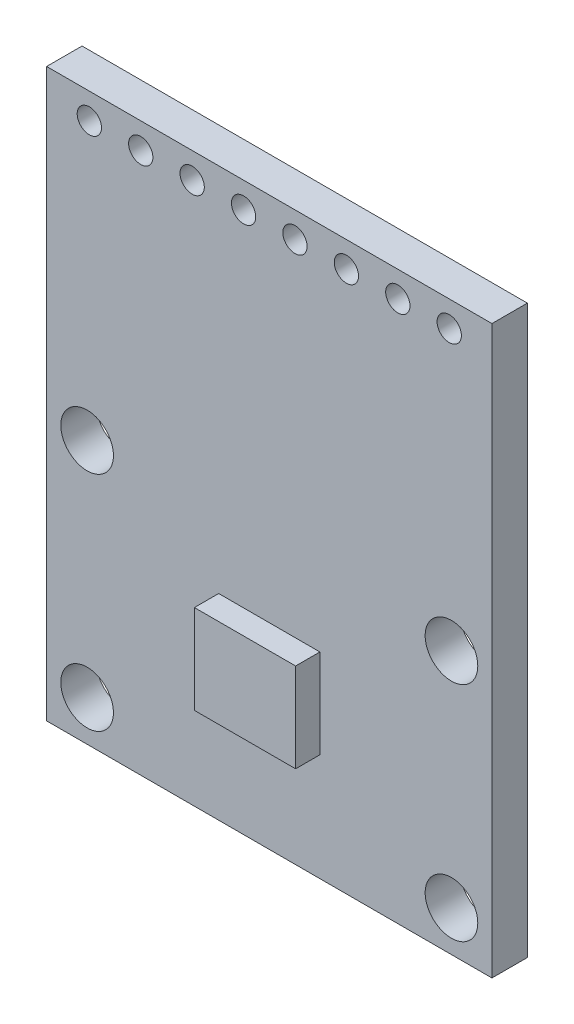
ISO-10303-21;
HEADER;
FILE_DESCRIPTION(('STEP AP214'),'2;1');
FILE_NAME('part.step','',(''),(''),'','','');
FILE_SCHEMA(('AUTOMOTIVE_DESIGN { 1 0 10303 214 1 1 1 1 }'));
ENDSEC;
DATA;
#1=APPLICATION_CONTEXT('core data for automotive mechanical design processes');
#2=APPLICATION_PROTOCOL_DEFINITION('international standard','automotive_design',2000,#1);
#3=PRODUCT_CONTEXT('',#1,'mechanical');
#4=PRODUCT('Part','Part','',(#3));
#5=PRODUCT_RELATED_PRODUCT_CATEGORY('part','',(#4));
#6=PRODUCT_DEFINITION_FORMATION('','',#4);
#7=PRODUCT_DEFINITION_CONTEXT('part definition',#1,'design');
#8=PRODUCT_DEFINITION('design','',#6,#7);
#9=PRODUCT_DEFINITION_SHAPE('','',#8);
#10=(LENGTH_UNIT() NAMED_UNIT(*) SI_UNIT(.MILLI.,.METRE.));
#11=(NAMED_UNIT(*) PLANE_ANGLE_UNIT() SI_UNIT($,.RADIAN.));
#12=(NAMED_UNIT(*) SI_UNIT($,.STERADIAN.) SOLID_ANGLE_UNIT());
#13=UNCERTAINTY_MEASURE_WITH_UNIT(LENGTH_MEASURE(1.E-05),#10,'distance_accuracy_value','');
#14=(GEOMETRIC_REPRESENTATION_CONTEXT(3) GLOBAL_UNCERTAINTY_ASSIGNED_CONTEXT((#13)) GLOBAL_UNIT_ASSIGNED_CONTEXT((#10,
#11,#12)) REPRESENTATION_CONTEXT('',''));
#15=CARTESIAN_POINT('',(0.,0.,0.));
#16=DIRECTION('',(0.,0.,1.));
#17=DIRECTION('',(1.,0.,0.));
#18=AXIS2_PLACEMENT_3D('',#15,#16,#17);
#19=CARTESIAN_POINT('',(0.,0.,1.75));
#20=DIRECTION('',(0.,0.,-1.));
#21=DIRECTION('',(-1.,0.,0.));
#22=AXIS2_PLACEMENT_3D('',#19,#20,#21);
#23=PLANE('',#22);
#24=CARTESIAN_POINT('',(8.89,12.73,1.75));
#25=DIRECTION('',(0.,0.,-1.));
#26=DIRECTION('',(-1.,0.,0.));
#27=AXIS2_PLACEMENT_3D('',#24,#25,#26);
#28=CIRCLE('',#27,0.6);
#29=CARTESIAN_POINT('',(8.29,12.73,1.75));
#30=VERTEX_POINT('',#29);
#31=EDGE_CURVE('E121',#30,#30,#28,.T.);
#32=ORIENTED_EDGE('',*,*,#31,.T.);
#33=EDGE_LOOP('',(#32));
#34=FACE_BOUND('',#33,.T.);
#35=CARTESIAN_POINT('',(3.81,12.73,1.75));
#36=DIRECTION('',(0.,0.,-1.));
#37=DIRECTION('',(-1.,0.,0.));
#38=AXIS2_PLACEMENT_3D('',#35,#36,#37);
#39=CIRCLE('',#38,0.6);
#40=CARTESIAN_POINT('',(3.21,12.73,1.75));
#41=VERTEX_POINT('',#40);
#42=EDGE_CURVE('E136',#41,#41,#39,.T.);
#43=ORIENTED_EDGE('',*,*,#42,.T.);
#44=EDGE_LOOP('',(#43));
#45=FACE_BOUND('',#44,.T.);
#46=CARTESIAN_POINT('',(-8.89,12.73,1.75));
#47=DIRECTION('',(0.,0.,1.));
#48=DIRECTION('',(1.,0.,0.));
#49=AXIS2_PLACEMENT_3D('',#46,#47,#48);
#50=CIRCLE('',#49,0.6);
#51=CARTESIAN_POINT('',(-8.29,12.73,1.75));
#52=VERTEX_POINT('',#51);
#53=EDGE_CURVE('E11',#52,#52,#50,.T.);
#54=ORIENTED_EDGE('',*,*,#53,.F.);
#55=EDGE_LOOP('',(#54));
#56=FACE_BOUND('',#55,.T.);
#57=CARTESIAN_POINT('',(-6.35,12.73,1.75));
#58=DIRECTION('',(0.,0.,1.));
#59=DIRECTION('',(1.,0.,0.));
#60=AXIS2_PLACEMENT_3D('',#57,#58,#59);
#61=CIRCLE('',#60,0.6);
#62=CARTESIAN_POINT('',(-5.75,12.73,1.75));
#63=VERTEX_POINT('',#62);
#64=EDGE_CURVE('E222',#63,#63,#61,.T.);
#65=ORIENTED_EDGE('',*,*,#64,.F.);
#66=EDGE_LOOP('',(#65));
#67=FACE_BOUND('',#66,.T.);
#68=DIRECTION('',(0.,1.,0.));
#69=VECTOR('',#68,1.);
#70=CARTESIAN_POINT('',(11.,-14.,1.75));
#71=LINE('',#70,#69);
#72=CARTESIAN_POINT('',(11.,-14.,1.75));
#73=VERTEX_POINT('',#72);
#74=CARTESIAN_POINT('',(11.,14.,1.75));
#75=VERTEX_POINT('',#74);
#76=EDGE_CURVE('E190',#73,#75,#71,.T.);
#77=ORIENTED_EDGE('',*,*,#76,.T.);
#78=DIRECTION('',(-1.,0.,0.));
#79=VECTOR('',#78,1.);
#80=CARTESIAN_POINT('',(-11.,14.,1.75));
#81=LINE('',#80,#79);
#82=CARTESIAN_POINT('',(-11.,14.,1.75));
#83=VERTEX_POINT('',#82);
#84=EDGE_CURVE('E193',#75,#83,#81,.T.);
#85=ORIENTED_EDGE('',*,*,#84,.T.);
#86=DIRECTION('',(0.,-1.,0.));
#87=VECTOR('',#86,1.);
#88=CARTESIAN_POINT('',(-11.,-14.,1.75));
#89=LINE('',#88,#87);
#90=CARTESIAN_POINT('',(-11.,-14.,1.75));
#91=VERTEX_POINT('',#90);
#92=EDGE_CURVE('E196',#83,#91,#89,.T.);
#93=ORIENTED_EDGE('',*,*,#92,.T.);
#94=DIRECTION('',(1.,0.,0.));
#95=VECTOR('',#94,1.);
#96=CARTESIAN_POINT('',(-11.,-14.,1.75));
#97=LINE('',#96,#95);
#98=EDGE_CURVE('E198',#91,#73,#97,.T.);
#99=ORIENTED_EDGE('',*,*,#98,.T.);
#100=EDGE_LOOP('',(#77,#85,#93,#99));
#101=FACE_BOUND('',#100,.T.);
#102=CARTESIAN_POINT('',(-9.,-0.99999999999995,1.75));
#103=DIRECTION('',(0.,0.,1.));
#104=DIRECTION('',(1.,0.,0.));
#105=AXIS2_PLACEMENT_3D('',#102,#103,#104);
#106=CIRCLE('',#105,1.3);
#107=CARTESIAN_POINT('',(-7.7,-0.99999999999995,1.75));
#108=VERTEX_POINT('',#107);
#109=EDGE_CURVE('E181',#108,#108,#106,.T.);
#110=ORIENTED_EDGE('',*,*,#109,.F.);
#111=EDGE_LOOP('',(#110));
#112=FACE_BOUND('',#111,.T.);
#113=CARTESIAN_POINT('',(-9.,-12.,1.75));
#114=DIRECTION('',(0.,0.,1.));
#115=DIRECTION('',(1.,0.,0.));
#116=AXIS2_PLACEMENT_3D('',#113,#114,#115);
#117=CIRCLE('',#116,1.3);
#118=CARTESIAN_POINT('',(-7.7,-12.,1.75));
#119=VERTEX_POINT('',#118);
#120=EDGE_CURVE('E175',#119,#119,#117,.T.);
#121=ORIENTED_EDGE('',*,*,#120,.F.);
#122=EDGE_LOOP('',(#121));
#123=FACE_BOUND('',#122,.T.);
#124=CARTESIAN_POINT('',(9.,-12.,1.75));
#125=DIRECTION('',(0.,0.,1.));
#126=DIRECTION('',(1.,0.,0.));
#127=AXIS2_PLACEMENT_3D('',#124,#125,#126);
#128=CIRCLE('',#127,1.3);
#129=CARTESIAN_POINT('',(10.3,-12.,1.75));
#130=VERTEX_POINT('',#129);
#131=EDGE_CURVE('E169',#130,#130,#128,.T.);
#132=ORIENTED_EDGE('',*,*,#131,.F.);
#133=EDGE_LOOP('',(#132));
#134=FACE_BOUND('',#133,.T.);
#135=CARTESIAN_POINT('',(9.,-0.99999999999995,1.75));
#136=DIRECTION('',(0.,0.,1.));
#137=DIRECTION('',(1.,0.,0.));
#138=AXIS2_PLACEMENT_3D('',#135,#136,#137);
#139=CIRCLE('',#138,1.3);
#140=CARTESIAN_POINT('',(10.3,-0.99999999999995,1.75));
#141=VERTEX_POINT('',#140);
#142=EDGE_CURVE('E165',#141,#141,#139,.T.);
#143=ORIENTED_EDGE('',*,*,#142,.F.);
#144=EDGE_LOOP('',(#143));
#145=FACE_BOUND('',#144,.T.);
#146=CARTESIAN_POINT('',(-1.27,12.73,1.75));
#147=DIRECTION('',(0.,0.,1.));
#148=DIRECTION('',(1.,0.,0.));
#149=AXIS2_PLACEMENT_3D('',#146,#147,#148);
#150=CIRCLE('',#149,0.6);
#151=CARTESIAN_POINT('',(-0.670000000000002,12.73,1.75));
#152=VERTEX_POINT('',#151);
#153=EDGE_CURVE('E156',#152,#152,#150,.T.);
#154=ORIENTED_EDGE('',*,*,#153,.F.);
#155=EDGE_LOOP('',(#154));
#156=FACE_BOUND('',#155,.T.);
#157=CARTESIAN_POINT('',(-3.81,12.73,1.75));
#158=DIRECTION('',(0.,0.,1.));
#159=DIRECTION('',(1.,0.,0.));
#160=AXIS2_PLACEMENT_3D('',#157,#158,#159);
#161=CIRCLE('',#160,0.6);
#162=CARTESIAN_POINT('',(-3.21,12.73,1.75));
#163=VERTEX_POINT('',#162);
#164=EDGE_CURVE('E153',#163,#163,#161,.T.);
#165=ORIENTED_EDGE('',*,*,#164,.F.);
#166=EDGE_LOOP('',(#165));
#167=FACE_BOUND('',#166,.T.);
#168=CARTESIAN_POINT('',(1.27,12.73,1.75));
#169=DIRECTION('',(0.,0.,-1.));
#170=DIRECTION('',(-1.,0.,0.));
#171=AXIS2_PLACEMENT_3D('',#168,#169,#170);
#172=CIRCLE('',#171,0.6);
#173=CARTESIAN_POINT('',(0.670000000000002,12.73,1.75));
#174=VERTEX_POINT('',#173);
#175=EDGE_CURVE('E142',#174,#174,#172,.T.);
#176=ORIENTED_EDGE('',*,*,#175,.T.);
#177=EDGE_LOOP('',(#176));
#178=FACE_BOUND('',#177,.T.);
#179=CARTESIAN_POINT('',(6.35,12.73,1.75));
#180=DIRECTION('',(0.,0.,-1.));
#181=DIRECTION('',(-1.,0.,0.));
#182=AXIS2_PLACEMENT_3D('',#179,#180,#181);
#183=CIRCLE('',#182,0.6);
#184=CARTESIAN_POINT('',(5.75,12.73,1.75));
#185=VERTEX_POINT('',#184);
#186=EDGE_CURVE('E130',#185,#185,#183,.T.);
#187=ORIENTED_EDGE('',*,*,#186,.T.);
#188=EDGE_LOOP('',(#187));
#189=FACE_BOUND('',#188,.T.);
#190=DIRECTION('',(0.,1.,0.));
#191=VECTOR('',#190,1.);
#192=CARTESIAN_POINT('',(2.5,-8.69999999999995,1.75));
#193=LINE('',#192,#191);
#194=CARTESIAN_POINT('',(2.5,-8.69999999999995,1.75));
#195=VERTEX_POINT('',#194);
#196=CARTESIAN_POINT('',(2.5,-4.29999999999995,1.75));
#197=VERTEX_POINT('',#196);
#198=EDGE_CURVE('E117',#195,#197,#193,.T.);
#199=ORIENTED_EDGE('',*,*,#198,.F.);
#200=DIRECTION('',(1.,0.,0.));
#201=VECTOR('',#200,1.);
#202=CARTESIAN_POINT('',(-2.5,-8.69999999999995,1.75));
#203=LINE('',#202,#201);
#204=CARTESIAN_POINT('',(-2.5,-8.69999999999995,1.75));
#205=VERTEX_POINT('',#204);
#206=EDGE_CURVE('E114',#205,#195,#203,.T.);
#207=ORIENTED_EDGE('',*,*,#206,.F.);
#208=DIRECTION('',(0.,-1.,0.));
#209=VECTOR('',#208,1.);
#210=CARTESIAN_POINT('',(-2.5,-8.69999999999995,1.75));
#211=LINE('',#210,#209);
#212=CARTESIAN_POINT('',(-2.5,-4.29999999999995,1.75));
#213=VERTEX_POINT('',#212);
#214=EDGE_CURVE('E52',#213,#205,#211,.T.);
#215=ORIENTED_EDGE('',*,*,#214,.F.);
#216=DIRECTION('',(-1.,0.,0.));
#217=VECTOR('',#216,1.);
#218=CARTESIAN_POINT('',(-2.5,-4.29999999999995,1.75));
#219=LINE('',#218,#217);
#220=EDGE_CURVE('E47',#197,#213,#219,.T.);
#221=ORIENTED_EDGE('',*,*,#220,.F.);
#222=EDGE_LOOP('',(#199,#207,#215,#221));
#223=FACE_BOUND('',#222,.T.);
#224=ADVANCED_FACE('F32',(#34,#45,#56,#67,#101,#112,#123,#134,#145,#156,#167,#178,#189,#223),
#23,.F.);
#225=CARTESIAN_POINT('',(0.,0.,0.));
#226=DIRECTION('',(0.,0.,-1.));
#227=DIRECTION('',(-1.,0.,0.));
#228=AXIS2_PLACEMENT_3D('',#225,#226,#227);
#229=PLANE('',#228);
#230=CARTESIAN_POINT('',(6.35,12.73,0.));
#231=DIRECTION('',(0.,0.,-1.));
#232=DIRECTION('',(-1.,0.,0.));
#233=AXIS2_PLACEMENT_3D('',#230,#231,#232);
#234=CIRCLE('',#233,0.6);
#235=CARTESIAN_POINT('',(5.75,12.73,0.));
#236=VERTEX_POINT('',#235);
#237=EDGE_CURVE('E133',#236,#236,#234,.T.);
#238=ORIENTED_EDGE('',*,*,#237,.F.);
#239=EDGE_LOOP('',(#238));
#240=FACE_BOUND('',#239,.T.);
#241=CARTESIAN_POINT('',(1.27,12.73,0.));
#242=DIRECTION('',(0.,0.,-1.));
#243=DIRECTION('',(-1.,0.,0.));
#244=AXIS2_PLACEMENT_3D('',#241,#242,#243);
#245=CIRCLE('',#244,0.6);
#246=CARTESIAN_POINT('',(0.670000000000002,12.73,0.));
#247=VERTEX_POINT('',#246);
#248=EDGE_CURVE('E145',#247,#247,#245,.T.);
#249=ORIENTED_EDGE('',*,*,#248,.F.);
#250=EDGE_LOOP('',(#249));
#251=FACE_BOUND('',#250,.T.);
#252=CARTESIAN_POINT('',(-3.81,12.73,0.));
#253=DIRECTION('',(0.,0.,1.));
#254=DIRECTION('',(1.,0.,0.));
#255=AXIS2_PLACEMENT_3D('',#252,#253,#254);
#256=CIRCLE('',#255,0.6);
#257=CARTESIAN_POINT('',(-3.21,12.73,0.));
#258=VERTEX_POINT('',#257);
#259=EDGE_CURVE('E148',#258,#258,#256,.T.);
#260=ORIENTED_EDGE('',*,*,#259,.T.);
#261=EDGE_LOOP('',(#260));
#262=FACE_BOUND('',#261,.T.);
#263=CARTESIAN_POINT('',(-1.27,12.73,0.));
#264=DIRECTION('',(0.,0.,1.));
#265=DIRECTION('',(1.,0.,0.));
#266=AXIS2_PLACEMENT_3D('',#263,#264,#265);
#267=CIRCLE('',#266,0.6);
#268=CARTESIAN_POINT('',(-0.670000000000002,12.73,0.));
#269=VERTEX_POINT('',#268);
#270=EDGE_CURVE('E157',#269,#269,#267,.T.);
#271=ORIENTED_EDGE('',*,*,#270,.T.);
#272=EDGE_LOOP('',(#271));
#273=FACE_BOUND('',#272,.T.);
#274=CARTESIAN_POINT('',(0.,-6.49999999999995,0.));
#275=DIRECTION('',(0.,0.,1.));
#276=DIRECTION('',(1.,0.,0.));
#277=AXIS2_PLACEMENT_3D('',#274,#275,#276);
#278=CIRCLE('',#277,1.);
#279=CARTESIAN_POINT('',(0.999999999999997,-6.49999999999995,0.));
#280=VERTEX_POINT('',#279);
#281=EDGE_CURVE('E160',#280,#280,#278,.T.);
#282=ORIENTED_EDGE('',*,*,#281,.T.);
#283=EDGE_LOOP('',(#282));
#284=FACE_BOUND('',#283,.T.);
#285=CARTESIAN_POINT('',(9.,-0.99999999999995,0.));
#286=DIRECTION('',(0.,0.,1.));
#287=DIRECTION('',(1.,0.,0.));
#288=AXIS2_PLACEMENT_3D('',#285,#286,#287);
#289=CIRCLE('',#288,1.3);
#290=CARTESIAN_POINT('',(10.3,-0.99999999999995,0.));
#291=VERTEX_POINT('',#290);
#292=EDGE_CURVE('E166',#291,#291,#289,.T.);
#293=ORIENTED_EDGE('',*,*,#292,.T.);
#294=EDGE_LOOP('',(#293));
#295=FACE_BOUND('',#294,.T.);
#296=CARTESIAN_POINT('',(9.,-12.,0.));
#297=DIRECTION('',(0.,0.,1.));
#298=DIRECTION('',(1.,0.,0.));
#299=AXIS2_PLACEMENT_3D('',#296,#297,#298);
#300=CIRCLE('',#299,1.3);
#301=CARTESIAN_POINT('',(10.3,-12.,0.));
#302=VERTEX_POINT('',#301);
#303=EDGE_CURVE('E172',#302,#302,#300,.T.);
#304=ORIENTED_EDGE('',*,*,#303,.T.);
#305=EDGE_LOOP('',(#304));
#306=FACE_BOUND('',#305,.T.);
#307=CARTESIAN_POINT('',(-9.,-12.,0.));
#308=DIRECTION('',(0.,0.,1.));
#309=DIRECTION('',(1.,0.,0.));
#310=AXIS2_PLACEMENT_3D('',#307,#308,#309);
#311=CIRCLE('',#310,1.3);
#312=CARTESIAN_POINT('',(-7.7,-12.,0.));
#313=VERTEX_POINT('',#312);
#314=EDGE_CURVE('E178',#313,#313,#311,.T.);
#315=ORIENTED_EDGE('',*,*,#314,.T.);
#316=EDGE_LOOP('',(#315));
#317=FACE_BOUND('',#316,.T.);
#318=CARTESIAN_POINT('',(-9.,-0.99999999999995,0.));
#319=DIRECTION('',(0.,0.,1.));
#320=DIRECTION('',(1.,0.,0.));
#321=AXIS2_PLACEMENT_3D('',#318,#319,#320);
#322=CIRCLE('',#321,1.3);
#323=CARTESIAN_POINT('',(-7.7,-0.99999999999995,0.));
#324=VERTEX_POINT('',#323);
#325=EDGE_CURVE('E184',#324,#324,#322,.T.);
#326=ORIENTED_EDGE('',*,*,#325,.T.);
#327=EDGE_LOOP('',(#326));
#328=FACE_BOUND('',#327,.T.);
#329=DIRECTION('',(0.,1.,0.));
#330=VECTOR('',#329,1.);
#331=CARTESIAN_POINT('',(11.,-14.,0.));
#332=LINE('',#331,#330);
#333=CARTESIAN_POINT('',(11.,-14.,0.));
#334=VERTEX_POINT('',#333);
#335=CARTESIAN_POINT('',(11.,14.,0.));
#336=VERTEX_POINT('',#335);
#337=EDGE_CURVE('E187',#334,#336,#332,.T.);
#338=ORIENTED_EDGE('',*,*,#337,.F.);
#339=DIRECTION('',(1.,0.,0.));
#340=VECTOR('',#339,1.);
#341=CARTESIAN_POINT('',(-11.,-14.,0.));
#342=LINE('',#341,#340);
#343=CARTESIAN_POINT('',(-11.,-14.,0.));
#344=VERTEX_POINT('',#343);
#345=EDGE_CURVE('E194',#344,#334,#342,.T.);
#346=ORIENTED_EDGE('',*,*,#345,.F.);
#347=DIRECTION('',(0.,-1.,0.));
#348=VECTOR('',#347,1.);
#349=CARTESIAN_POINT('',(-11.,-14.,0.));
#350=LINE('',#349,#348);
#351=CARTESIAN_POINT('',(-11.,14.,0.));
#352=VERTEX_POINT('',#351);
#353=EDGE_CURVE('E205',#352,#344,#350,.T.);
#354=ORIENTED_EDGE('',*,*,#353,.F.);
#355=DIRECTION('',(-1.,0.,0.));
#356=VECTOR('',#355,1.);
#357=CARTESIAN_POINT('',(-11.,14.,0.));
#358=LINE('',#357,#356);
#359=EDGE_CURVE('E203',#336,#352,#358,.T.);
#360=ORIENTED_EDGE('',*,*,#359,.F.);
#361=EDGE_LOOP('',(#338,#346,#354,#360));
#362=FACE_BOUND('',#361,.T.);
#363=CARTESIAN_POINT('',(-6.35,12.73,0.));
#364=DIRECTION('',(0.,0.,1.));
#365=DIRECTION('',(1.,0.,0.));
#366=AXIS2_PLACEMENT_3D('',#363,#364,#365);
#367=CIRCLE('',#366,0.6);
#368=CARTESIAN_POINT('',(-5.75,12.73,0.));
#369=VERTEX_POINT('',#368);
#370=EDGE_CURVE('E219',#369,#369,#367,.T.);
#371=ORIENTED_EDGE('',*,*,#370,.T.);
#372=EDGE_LOOP('',(#371));
#373=FACE_BOUND('',#372,.T.);
#374=CARTESIAN_POINT('',(-8.89,12.73,0.));
#375=DIRECTION('',(0.,0.,1.));
#376=DIRECTION('',(1.,0.,0.));
#377=AXIS2_PLACEMENT_3D('',#374,#375,#376);
#378=CIRCLE('',#377,0.6);
#379=CARTESIAN_POINT('',(-8.29,12.73,0.));
#380=VERTEX_POINT('',#379);
#381=EDGE_CURVE('E40',#380,#380,#378,.T.);
#382=ORIENTED_EDGE('',*,*,#381,.T.);
#383=EDGE_LOOP('',(#382));
#384=FACE_BOUND('',#383,.T.);
#385=CARTESIAN_POINT('',(3.81,12.73,0.));
#386=DIRECTION('',(0.,0.,-1.));
#387=DIRECTION('',(-1.,0.,0.));
#388=AXIS2_PLACEMENT_3D('',#385,#386,#387);
#389=CIRCLE('',#388,0.6);
#390=CARTESIAN_POINT('',(3.21,12.73,0.));
#391=VERTEX_POINT('',#390);
#392=EDGE_CURVE('E139',#391,#391,#389,.T.);
#393=ORIENTED_EDGE('',*,*,#392,.F.);
#394=EDGE_LOOP('',(#393));
#395=FACE_BOUND('',#394,.T.);
#396=CARTESIAN_POINT('',(8.89,12.73,0.));
#397=DIRECTION('',(0.,0.,-1.));
#398=DIRECTION('',(-1.,0.,0.));
#399=AXIS2_PLACEMENT_3D('',#396,#397,#398);
#400=CIRCLE('',#399,0.6);
#401=CARTESIAN_POINT('',(8.29,12.73,0.));
#402=VERTEX_POINT('',#401);
#403=EDGE_CURVE('E127',#402,#402,#400,.T.);
#404=ORIENTED_EDGE('',*,*,#403,.F.);
#405=EDGE_LOOP('',(#404));
#406=FACE_BOUND('',#405,.T.);
#407=ADVANCED_FACE('F227',(#240,#251,#262,#273,#284,#295,#306,#317,#328,#362,#373,#384,#395,
#406),#229,.T.);
#408=CARTESIAN_POINT('',(11.,-14.,1.75));
#409=DIRECTION('',(-1.,0.,0.));
#410=DIRECTION('',(0.,0.,1.));
#411=AXIS2_PLACEMENT_3D('',#408,#409,#410);
#412=PLANE('',#411);
#413=ORIENTED_EDGE('',*,*,#337,.T.);
#414=DIRECTION('',(0.,0.,-1.));
#415=VECTOR('',#414,1.);
#416=CARTESIAN_POINT('',(11.,14.,1.75));
#417=LINE('',#416,#415);
#418=EDGE_CURVE('E216',#75,#336,#417,.T.);
#419=ORIENTED_EDGE('',*,*,#418,.F.);
#420=ORIENTED_EDGE('',*,*,#76,.F.);
#421=DIRECTION('',(0.,0.,-1.));
#422=VECTOR('',#421,1.);
#423=CARTESIAN_POINT('',(11.,-14.,1.75));
#424=LINE('',#423,#422);
#425=EDGE_CURVE('E200',#73,#334,#424,.T.);
#426=ORIENTED_EDGE('',*,*,#425,.T.);
#427=EDGE_LOOP('',(#413,#419,#420,#426));
#428=FACE_BOUND('',#427,.T.);
#429=ADVANCED_FACE('F334',(#428),#412,.F.);
#430=CARTESIAN_POINT('',(-11.,14.,1.75));
#431=DIRECTION('',(0.,-1.,0.));
#432=DIRECTION('',(0.,0.,-1.));
#433=AXIS2_PLACEMENT_3D('',#430,#431,#432);
#434=PLANE('',#433);
#435=ORIENTED_EDGE('',*,*,#359,.T.);
#436=DIRECTION('',(0.,0.,-1.));
#437=VECTOR('',#436,1.);
#438=CARTESIAN_POINT('',(-11.,14.,1.75));
#439=LINE('',#438,#437);
#440=EDGE_CURVE('E213',#83,#352,#439,.T.);
#441=ORIENTED_EDGE('',*,*,#440,.F.);
#442=ORIENTED_EDGE('',*,*,#84,.F.);
#443=ORIENTED_EDGE('',*,*,#418,.T.);
#444=EDGE_LOOP('',(#435,#441,#442,#443));
#445=FACE_BOUND('',#444,.T.);
#446=ADVANCED_FACE('F342',(#445),#434,.F.);
#447=CARTESIAN_POINT('',(-11.,-14.,1.75));
#448=DIRECTION('',(1.,0.,0.));
#449=DIRECTION('',(0.,0.,-1.));
#450=AXIS2_PLACEMENT_3D('',#447,#448,#449);
#451=PLANE('',#450);
#452=ORIENTED_EDGE('',*,*,#353,.T.);
#453=DIRECTION('',(0.,0.,-1.));
#454=VECTOR('',#453,1.);
#455=CARTESIAN_POINT('',(-11.,-14.,1.75));
#456=LINE('',#455,#454);
#457=EDGE_CURVE('E210',#91,#344,#456,.T.);
#458=ORIENTED_EDGE('',*,*,#457,.F.);
#459=ORIENTED_EDGE('',*,*,#92,.F.);
#460=ORIENTED_EDGE('',*,*,#440,.T.);
#461=EDGE_LOOP('',(#452,#458,#459,#460));
#462=FACE_BOUND('',#461,.T.);
#463=ADVANCED_FACE('F338',(#462),#451,.F.);
#464=CARTESIAN_POINT('',(-11.,-14.,1.75));
#465=DIRECTION('',(0.,1.,0.));
#466=DIRECTION('',(0.,0.,1.));
#467=AXIS2_PLACEMENT_3D('',#464,#465,#466);
#468=PLANE('',#467);
#469=ORIENTED_EDGE('',*,*,#345,.T.);
#470=ORIENTED_EDGE('',*,*,#425,.F.);
#471=ORIENTED_EDGE('',*,*,#98,.F.);
#472=ORIENTED_EDGE('',*,*,#457,.T.);
#473=EDGE_LOOP('',(#469,#470,#471,#472));
#474=FACE_BOUND('',#473,.T.);
#475=ADVANCED_FACE('F329',(#474),#468,.F.);
#476=CARTESIAN_POINT('',(-9.,-0.99999999999995,0.));
#477=DIRECTION('',(0.,0.,1.));
#478=DIRECTION('',(1.,0.,0.));
#479=AXIS2_PLACEMENT_3D('',#476,#477,#478);
#480=CYLINDRICAL_SURFACE('',#479,1.3);
#481=ORIENTED_EDGE('',*,*,#325,.F.);
#482=EDGE_LOOP('',(#481));
#483=FACE_BOUND('',#482,.T.);
#484=ORIENTED_EDGE('',*,*,#109,.T.);
#485=EDGE_LOOP('',(#484));
#486=FACE_BOUND('',#485,.T.);
#487=ADVANCED_FACE('F326',(#483,#486),#480,.F.);
#488=CARTESIAN_POINT('',(-9.,-12.,0.));
#489=DIRECTION('',(0.,0.,1.));
#490=DIRECTION('',(1.,0.,0.));
#491=AXIS2_PLACEMENT_3D('',#488,#489,#490);
#492=CYLINDRICAL_SURFACE('',#491,1.3);
#493=ORIENTED_EDGE('',*,*,#314,.F.);
#494=EDGE_LOOP('',(#493));
#495=FACE_BOUND('',#494,.T.);
#496=ORIENTED_EDGE('',*,*,#120,.T.);
#497=EDGE_LOOP('',(#496));
#498=FACE_BOUND('',#497,.T.);
#499=ADVANCED_FACE('F322',(#495,#498),#492,.F.);
#500=CARTESIAN_POINT('',(9.,-12.,0.));
#501=DIRECTION('',(0.,0.,1.));
#502=DIRECTION('',(1.,0.,0.));
#503=AXIS2_PLACEMENT_3D('',#500,#501,#502);
#504=CYLINDRICAL_SURFACE('',#503,1.3);
#505=ORIENTED_EDGE('',*,*,#303,.F.);
#506=EDGE_LOOP('',(#505));
#507=FACE_BOUND('',#506,.T.);
#508=ORIENTED_EDGE('',*,*,#131,.T.);
#509=EDGE_LOOP('',(#508));
#510=FACE_BOUND('',#509,.T.);
#511=ADVANCED_FACE('F318',(#507,#510),#504,.F.);
#512=CARTESIAN_POINT('',(9.,-0.99999999999995,0.));
#513=DIRECTION('',(0.,0.,1.));
#514=DIRECTION('',(1.,0.,0.));
#515=AXIS2_PLACEMENT_3D('',#512,#513,#514);
#516=CYLINDRICAL_SURFACE('',#515,1.3);
#517=ORIENTED_EDGE('',*,*,#292,.F.);
#518=EDGE_LOOP('',(#517));
#519=FACE_BOUND('',#518,.T.);
#520=ORIENTED_EDGE('',*,*,#142,.T.);
#521=EDGE_LOOP('',(#520));
#522=FACE_BOUND('',#521,.T.);
#523=ADVANCED_FACE('F314',(#519,#522),#516,.F.);
#524=CARTESIAN_POINT('',(0.,-6.49999999999995,0.));
#525=DIRECTION('',(0.,0.,1.));
#526=DIRECTION('',(1.,0.,0.));
#527=AXIS2_PLACEMENT_3D('',#524,#525,#526);
#528=CYLINDRICAL_SURFACE('',#527,1.);
#529=ORIENTED_EDGE('',*,*,#281,.F.);
#530=EDGE_LOOP('',(#529));
#531=FACE_BOUND('',#530,.T.);
#532=CARTESIAN_POINT('',(0.,-6.49999999999995,1.75));
#533=DIRECTION('',(0.,0.,-1.));
#534=DIRECTION('',(-1.,0.,0.));
#535=AXIS2_PLACEMENT_3D('',#532,#533,#534);
#536=CIRCLE('',#535,1.);
#537=CARTESIAN_POINT('',(-1.,-6.49999999999995,1.75));
#538=VERTEX_POINT('',#537);
#539=EDGE_CURVE('E118',#538,#538,#536,.F.);
#540=ORIENTED_EDGE('',*,*,#539,.T.);
#541=EDGE_LOOP('',(#540));
#542=FACE_BOUND('',#541,.T.);
#543=ADVANCED_FACE('F310',(#531,#542),#528,.F.);
#544=CARTESIAN_POINT('',(-1.27,12.73,0.));
#545=DIRECTION('',(0.,0.,1.));
#546=DIRECTION('',(1.,0.,0.));
#547=AXIS2_PLACEMENT_3D('',#544,#545,#546);
#548=CYLINDRICAL_SURFACE('',#547,0.6);
#549=ORIENTED_EDGE('',*,*,#270,.F.);
#550=EDGE_LOOP('',(#549));
#551=FACE_BOUND('',#550,.T.);
#552=ORIENTED_EDGE('',*,*,#153,.T.);
#553=EDGE_LOOP('',(#552));
#554=FACE_BOUND('',#553,.T.);
#555=ADVANCED_FACE('F306',(#551,#554),#548,.F.);
#556=CARTESIAN_POINT('',(-3.81,12.73,0.));
#557=DIRECTION('',(0.,0.,1.));
#558=DIRECTION('',(1.,0.,0.));
#559=AXIS2_PLACEMENT_3D('',#556,#557,#558);
#560=CYLINDRICAL_SURFACE('',#559,0.6);
#561=ORIENTED_EDGE('',*,*,#259,.F.);
#562=EDGE_LOOP('',(#561));
#563=FACE_BOUND('',#562,.T.);
#564=ORIENTED_EDGE('',*,*,#164,.T.);
#565=EDGE_LOOP('',(#564));
#566=FACE_BOUND('',#565,.T.);
#567=ADVANCED_FACE('F303',(#563,#566),#560,.F.);
#568=CARTESIAN_POINT('',(-6.35,12.73,0.));
#569=DIRECTION('',(0.,0.,1.));
#570=DIRECTION('',(1.,0.,0.));
#571=AXIS2_PLACEMENT_3D('',#568,#569,#570);
#572=CYLINDRICAL_SURFACE('',#571,0.6);
#573=ORIENTED_EDGE('',*,*,#370,.F.);
#574=EDGE_LOOP('',(#573));
#575=FACE_BOUND('',#574,.T.);
#576=ORIENTED_EDGE('',*,*,#64,.T.);
#577=EDGE_LOOP('',(#576));
#578=FACE_BOUND('',#577,.T.);
#579=ADVANCED_FACE('F233',(#575,#578),#572,.F.);
#580=CARTESIAN_POINT('',(-8.89,12.73,0.));
#581=DIRECTION('',(0.,0.,1.));
#582=DIRECTION('',(1.,0.,0.));
#583=AXIS2_PLACEMENT_3D('',#580,#581,#582);
#584=CYLINDRICAL_SURFACE('',#583,0.6);
#585=ORIENTED_EDGE('',*,*,#381,.F.);
#586=EDGE_LOOP('',(#585));
#587=FACE_BOUND('',#586,.T.);
#588=ORIENTED_EDGE('',*,*,#53,.T.);
#589=EDGE_LOOP('',(#588));
#590=FACE_BOUND('',#589,.T.);
#591=ADVANCED_FACE('F34',(#587,#590),#584,.F.);
#592=CARTESIAN_POINT('',(1.27,12.73,0.));
#593=DIRECTION('',(0.,0.,1.));
#594=DIRECTION('',(1.,0.,0.));
#595=AXIS2_PLACEMENT_3D('',#592,#593,#594);
#596=CYLINDRICAL_SURFACE('',#595,0.6);
#597=ORIENTED_EDGE('',*,*,#248,.T.);
#598=EDGE_LOOP('',(#597));
#599=FACE_BOUND('',#598,.T.);
#600=ORIENTED_EDGE('',*,*,#175,.F.);
#601=EDGE_LOOP('',(#600));
#602=FACE_BOUND('',#601,.T.);
#603=ADVANCED_FACE('F232',(#599,#602),#596,.F.);
#604=CARTESIAN_POINT('',(3.81,12.73,0.));
#605=DIRECTION('',(0.,0.,1.));
#606=DIRECTION('',(1.,0.,0.));
#607=AXIS2_PLACEMENT_3D('',#604,#605,#606);
#608=CYLINDRICAL_SURFACE('',#607,0.6);
#609=ORIENTED_EDGE('',*,*,#392,.T.);
#610=EDGE_LOOP('',(#609));
#611=FACE_BOUND('',#610,.T.);
#612=ORIENTED_EDGE('',*,*,#42,.F.);
#613=EDGE_LOOP('',(#612));
#614=FACE_BOUND('',#613,.T.);
#615=ADVANCED_FACE('F295',(#611,#614),#608,.F.);
#616=CARTESIAN_POINT('',(6.35,12.73,0.));
#617=DIRECTION('',(0.,0.,1.));
#618=DIRECTION('',(1.,0.,0.));
#619=AXIS2_PLACEMENT_3D('',#616,#617,#618);
#620=CYLINDRICAL_SURFACE('',#619,0.6);
#621=ORIENTED_EDGE('',*,*,#237,.T.);
#622=EDGE_LOOP('',(#621));
#623=FACE_BOUND('',#622,.T.);
#624=ORIENTED_EDGE('',*,*,#186,.F.);
#625=EDGE_LOOP('',(#624));
#626=FACE_BOUND('',#625,.T.);
#627=ADVANCED_FACE('F291',(#623,#626),#620,.F.);
#628=CARTESIAN_POINT('',(8.89,12.73,0.));
#629=DIRECTION('',(0.,0.,1.));
#630=DIRECTION('',(1.,0.,0.));
#631=AXIS2_PLACEMENT_3D('',#628,#629,#630);
#632=CYLINDRICAL_SURFACE('',#631,0.6);
#633=ORIENTED_EDGE('',*,*,#403,.T.);
#634=EDGE_LOOP('',(#633));
#635=FACE_BOUND('',#634,.T.);
#636=ORIENTED_EDGE('',*,*,#31,.F.);
#637=EDGE_LOOP('',(#636));
#638=FACE_BOUND('',#637,.T.);
#639=ADVANCED_FACE('F288',(#635,#638),#632,.F.);
#640=CARTESIAN_POINT('',(0.,0.,1.75));
#641=DIRECTION('',(0.,0.,-1.));
#642=DIRECTION('',(-1.,0.,0.));
#643=AXIS2_PLACEMENT_3D('',#640,#641,#642);
#644=PLANE('',#643);
#645=ORIENTED_EDGE('',*,*,#539,.F.);
#646=EDGE_LOOP('',(#645));
#647=FACE_BOUND('',#646,.T.);
#648=ADVANCED_FACE('F287',(#647),#644,.T.);
#649=CARTESIAN_POINT('',(2.5,-8.69999999999995,2.95));
#650=DIRECTION('',(-1.,0.,0.));
#651=DIRECTION('',(0.,0.,1.));
#652=AXIS2_PLACEMENT_3D('',#649,#650,#651);
#653=PLANE('',#652);
#654=ORIENTED_EDGE('',*,*,#198,.T.);
#655=DIRECTION('',(0.,0.,-1.));
#656=VECTOR('',#655,1.);
#657=CARTESIAN_POINT('',(2.5,-4.29999999999995,2.95));
#658=LINE('',#657,#656);
#659=CARTESIAN_POINT('',(2.5,-4.29999999999995,2.95));
#660=VERTEX_POINT('',#659);
#661=EDGE_CURVE('E98',#660,#197,#658,.T.);
#662=ORIENTED_EDGE('',*,*,#661,.F.);
#663=DIRECTION('',(0.,1.,0.));
#664=VECTOR('',#663,1.);
#665=CARTESIAN_POINT('',(2.5,-8.69999999999995,2.95));
#666=LINE('',#665,#664);
#667=CARTESIAN_POINT('',(2.5,-8.69999999999995,2.95));
#668=VERTEX_POINT('',#667);
#669=EDGE_CURVE('E105',#668,#660,#666,.T.);
#670=ORIENTED_EDGE('',*,*,#669,.F.);
#671=DIRECTION('',(0.,0.,-1.));
#672=VECTOR('',#671,1.);
#673=CARTESIAN_POINT('',(2.5,-8.69999999999995,2.95));
#674=LINE('',#673,#672);
#675=EDGE_CURVE('E265',#668,#195,#674,.T.);
#676=ORIENTED_EDGE('',*,*,#675,.T.);
#677=EDGE_LOOP('',(#654,#662,#670,#676));
#678=FACE_BOUND('',#677,.T.);
#679=ADVANCED_FACE('F116',(#678),#653,.F.);
#680=CARTESIAN_POINT('',(-2.5,-4.29999999999995,2.95));
#681=DIRECTION('',(0.,-1.,0.));
#682=DIRECTION('',(0.,0.,-1.));
#683=AXIS2_PLACEMENT_3D('',#680,#681,#682);
#684=PLANE('',#683);
#685=ORIENTED_EDGE('',*,*,#220,.T.);
#686=DIRECTION('',(0.,0.,-1.));
#687=VECTOR('',#686,1.);
#688=CARTESIAN_POINT('',(-2.5,-4.29999999999995,2.95));
#689=LINE('',#688,#687);
#690=CARTESIAN_POINT('',(-2.5,-4.29999999999995,2.95));
#691=VERTEX_POINT('',#690);
#692=EDGE_CURVE('E101',#691,#213,#689,.T.);
#693=ORIENTED_EDGE('',*,*,#692,.F.);
#694=DIRECTION('',(-1.,0.,0.));
#695=VECTOR('',#694,1.);
#696=CARTESIAN_POINT('',(-2.5,-4.29999999999995,2.95));
#697=LINE('',#696,#695);
#698=EDGE_CURVE('E94',#660,#691,#697,.T.);
#699=ORIENTED_EDGE('',*,*,#698,.F.);
#700=ORIENTED_EDGE('',*,*,#661,.T.);
#701=EDGE_LOOP('',(#685,#693,#699,#700));
#702=FACE_BOUND('',#701,.T.);
#703=ADVANCED_FACE('F96',(#702),#684,.F.);
#704=CARTESIAN_POINT('',(-2.5,-8.69999999999995,2.95));
#705=DIRECTION('',(1.,0.,0.));
#706=DIRECTION('',(0.,0.,-1.));
#707=AXIS2_PLACEMENT_3D('',#704,#705,#706);
#708=PLANE('',#707);
#709=ORIENTED_EDGE('',*,*,#214,.T.);
#710=DIRECTION('',(0.,0.,-1.));
#711=VECTOR('',#710,1.);
#712=CARTESIAN_POINT('',(-2.5,-8.69999999999995,2.95));
#713=LINE('',#712,#711);
#714=CARTESIAN_POINT('',(-2.5,-8.69999999999995,2.95));
#715=VERTEX_POINT('',#714);
#716=EDGE_CURVE('E123',#715,#205,#713,.T.);
#717=ORIENTED_EDGE('',*,*,#716,.F.);
#718=DIRECTION('',(0.,-1.,0.));
#719=VECTOR('',#718,1.);
#720=CARTESIAN_POINT('',(-2.5,-8.69999999999995,2.95));
#721=LINE('',#720,#719);
#722=EDGE_CURVE('E104',#691,#715,#721,.T.);
#723=ORIENTED_EDGE('',*,*,#722,.F.);
#724=ORIENTED_EDGE('',*,*,#692,.T.);
#725=EDGE_LOOP('',(#709,#717,#723,#724));
#726=FACE_BOUND('',#725,.T.);
#727=ADVANCED_FACE('F274',(#726),#708,.F.);
#728=CARTESIAN_POINT('',(-2.5,-8.69999999999995,2.95));
#729=DIRECTION('',(0.,1.,0.));
#730=DIRECTION('',(0.,0.,1.));
#731=AXIS2_PLACEMENT_3D('',#728,#729,#730);
#732=PLANE('',#731);
#733=ORIENTED_EDGE('',*,*,#206,.T.);
#734=ORIENTED_EDGE('',*,*,#675,.F.);
#735=DIRECTION('',(1.,0.,0.));
#736=VECTOR('',#735,1.);
#737=CARTESIAN_POINT('',(-2.5,-8.69999999999995,2.95));
#738=LINE('',#737,#736);
#739=EDGE_CURVE('E110',#715,#668,#738,.T.);
#740=ORIENTED_EDGE('',*,*,#739,.F.);
#741=ORIENTED_EDGE('',*,*,#716,.T.);
#742=EDGE_LOOP('',(#733,#734,#740,#741));
#743=FACE_BOUND('',#742,.T.);
#744=ADVANCED_FACE('F264',(#743),#732,.F.);
#745=CARTESIAN_POINT('',(0.,0.,2.95));
#746=DIRECTION('',(0.,0.,-1.));
#747=DIRECTION('',(-1.,0.,0.));
#748=AXIS2_PLACEMENT_3D('',#745,#746,#747);
#749=PLANE('',#748);
#750=ORIENTED_EDGE('',*,*,#669,.T.);
#751=ORIENTED_EDGE('',*,*,#698,.T.);
#752=ORIENTED_EDGE('',*,*,#722,.T.);
#753=ORIENTED_EDGE('',*,*,#739,.T.);
#754=EDGE_LOOP('',(#750,#751,#752,#753));
#755=FACE_BOUND('',#754,.T.);
#756=ADVANCED_FACE('F108',(#755),#749,.F.);
#757=CLOSED_SHELL('',(#224,#407,#429,#446,#463,#475,#487,#499,#511,#523,#543,#555,#567,#579,
#591,#603,#615,#627,#639,#648,#679,#703,#727,#744,#756));
#758=MANIFOLD_SOLID_BREP('B2',#757);
#759=ADVANCED_BREP_SHAPE_REPRESENTATION('',(#18,#758),#14);
#760=SHAPE_DEFINITION_REPRESENTATION(#9,#759);
ENDSEC;
END-ISO-10303-21;
